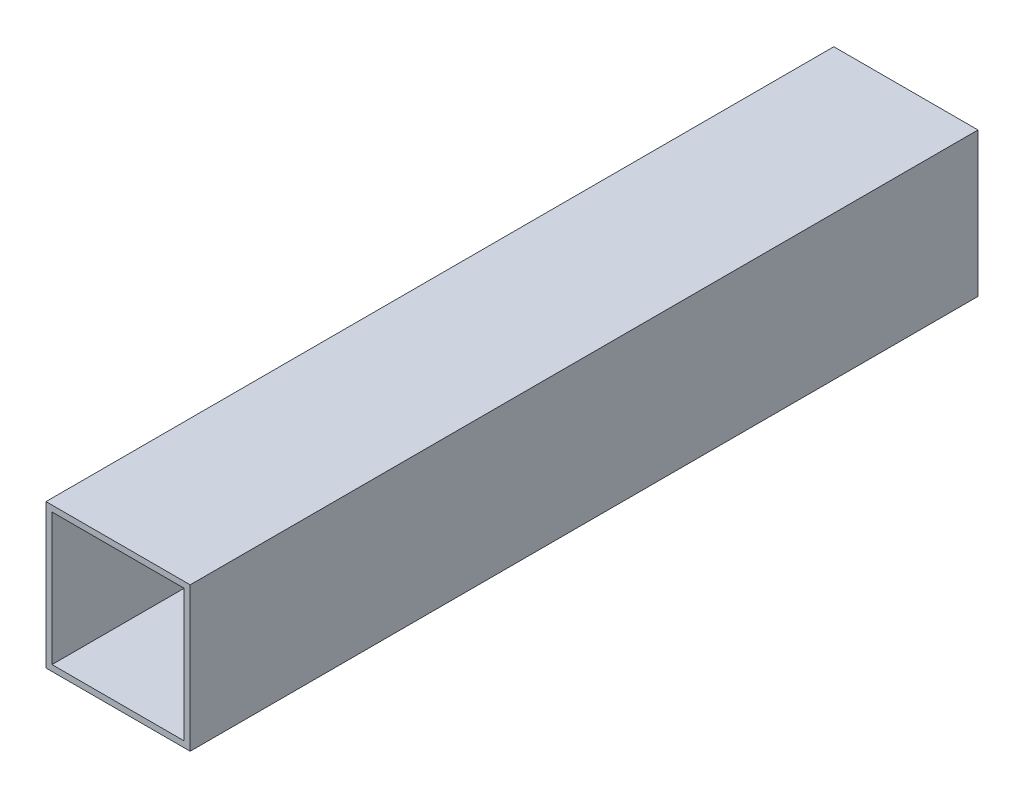
ISO-10303-21;
HEADER;
FILE_DESCRIPTION(('STEP AP214'),'2;1');
FILE_NAME('part.step','',(''),(''),'','','');
FILE_SCHEMA(('AUTOMOTIVE_DESIGN { 1 0 10303 214 1 1 1 1 }'));
ENDSEC;
DATA;
#1=APPLICATION_CONTEXT('core data for automotive mechanical design processes');
#2=APPLICATION_PROTOCOL_DEFINITION('international standard','automotive_design',2000,#1);
#3=PRODUCT_CONTEXT('',#1,'mechanical');
#4=PRODUCT('Part','Part','',(#3));
#5=PRODUCT_RELATED_PRODUCT_CATEGORY('part','',(#4));
#6=PRODUCT_DEFINITION_FORMATION('','',#4);
#7=PRODUCT_DEFINITION_CONTEXT('part definition',#1,'design');
#8=PRODUCT_DEFINITION('design','',#6,#7);
#9=PRODUCT_DEFINITION_SHAPE('','',#8);
#10=(LENGTH_UNIT() NAMED_UNIT(*) SI_UNIT(.MILLI.,.METRE.));
#11=(NAMED_UNIT(*) PLANE_ANGLE_UNIT() SI_UNIT($,.RADIAN.));
#12=(NAMED_UNIT(*) SI_UNIT($,.STERADIAN.) SOLID_ANGLE_UNIT());
#13=UNCERTAINTY_MEASURE_WITH_UNIT(LENGTH_MEASURE(1.E-05),#10,'distance_accuracy_value','');
#14=(GEOMETRIC_REPRESENTATION_CONTEXT(3) GLOBAL_UNCERTAINTY_ASSIGNED_CONTEXT((#13)) GLOBAL_UNIT_ASSIGNED_CONTEXT((#10,
#11,#12)) REPRESENTATION_CONTEXT('',''));
#15=CARTESIAN_POINT('',(0.,0.,0.));
#16=DIRECTION('',(0.,0.,1.));
#17=DIRECTION('',(1.,0.,0.));
#18=AXIS2_PLACEMENT_3D('',#15,#16,#17);
#19=CARTESIAN_POINT('',(0.,0.,208.2));
#20=DIRECTION('',(0.,0.,-1.));
#21=DIRECTION('',(-1.,0.,0.));
#22=AXIS2_PLACEMENT_3D('',#19,#20,#21);
#23=PLANE('',#22);
#24=DIRECTION('',(0.,1.,0.));
#25=VECTOR('',#24,1.);
#26=CARTESIAN_POINT('',(38.1,-38.1,208.2));
#27=LINE('',#26,#25);
#28=CARTESIAN_POINT('',(38.1,-38.1,208.2));
#29=VERTEX_POINT('',#28);
#30=CARTESIAN_POINT('',(38.1,38.1,208.2));
#31=VERTEX_POINT('',#30);
#32=EDGE_CURVE('E139',#29,#31,#27,.T.);
#33=ORIENTED_EDGE('',*,*,#32,.T.);
#34=DIRECTION('',(-1.,0.,0.));
#35=VECTOR('',#34,1.);
#36=CARTESIAN_POINT('',(-38.1,38.1,208.2));
#37=LINE('',#36,#35);
#38=CARTESIAN_POINT('',(-38.1,38.1,208.2));
#39=VERTEX_POINT('',#38);
#40=EDGE_CURVE('E142',#31,#39,#37,.T.);
#41=ORIENTED_EDGE('',*,*,#40,.T.);
#42=DIRECTION('',(0.,-1.,0.));
#43=VECTOR('',#42,1.);
#44=CARTESIAN_POINT('',(-38.1,-38.1,208.2));
#45=LINE('',#44,#43);
#46=CARTESIAN_POINT('',(-38.1,-38.1,208.2));
#47=VERTEX_POINT('',#46);
#48=EDGE_CURVE('E147',#39,#47,#45,.T.);
#49=ORIENTED_EDGE('',*,*,#48,.T.);
#50=DIRECTION('',(1.,0.,0.));
#51=VECTOR('',#50,1.);
#52=CARTESIAN_POINT('',(-38.1,-38.1,208.2));
#53=LINE('',#52,#51);
#54=EDGE_CURVE('E149',#47,#29,#53,.T.);
#55=ORIENTED_EDGE('',*,*,#54,.T.);
#56=EDGE_LOOP('',(#33,#41,#49,#55));
#57=FACE_BOUND('',#56,.T.);
#58=DIRECTION('',(0.,-1.,0.));
#59=VECTOR('',#58,1.);
#60=CARTESIAN_POINT('',(-34.925,-34.925,208.2));
#61=LINE('',#60,#59);
#62=CARTESIAN_POINT('',(-34.925,34.925,208.2));
#63=VERTEX_POINT('',#62);
#64=CARTESIAN_POINT('',(-34.925,-34.925,208.2));
#65=VERTEX_POINT('',#64);
#66=EDGE_CURVE('E101',#63,#65,#61,.T.);
#67=ORIENTED_EDGE('',*,*,#66,.F.);
#68=DIRECTION('',(-1.,0.,0.));
#69=VECTOR('',#68,1.);
#70=CARTESIAN_POINT('',(-34.925,34.925,208.2));
#71=LINE('',#70,#69);
#72=CARTESIAN_POINT('',(34.925,34.925,208.2));
#73=VERTEX_POINT('',#72);
#74=EDGE_CURVE('E128',#73,#63,#71,.T.);
#75=ORIENTED_EDGE('',*,*,#74,.F.);
#76=DIRECTION('',(0.,1.,0.));
#77=VECTOR('',#76,1.);
#78=CARTESIAN_POINT('',(34.925,-34.925,208.2));
#79=LINE('',#78,#77);
#80=CARTESIAN_POINT('',(34.925,-34.925,208.2));
#81=VERTEX_POINT('',#80);
#82=EDGE_CURVE('E125',#81,#73,#79,.T.);
#83=ORIENTED_EDGE('',*,*,#82,.F.);
#84=DIRECTION('',(1.,0.,0.));
#85=VECTOR('',#84,1.);
#86=CARTESIAN_POINT('',(-34.925,-34.925,208.2));
#87=LINE('',#86,#85);
#88=EDGE_CURVE('E115',#65,#81,#87,.T.);
#89=ORIENTED_EDGE('',*,*,#88,.F.);
#90=EDGE_LOOP('',(#67,#75,#83,#89));
#91=FACE_BOUND('',#90,.T.);
#92=ADVANCED_FACE('F39',(#57,#91),#23,.F.);
#93=CARTESIAN_POINT('',(0.,0.,-208.2));
#94=DIRECTION('',(0.,0.,-1.));
#95=DIRECTION('',(-1.,0.,0.));
#96=AXIS2_PLACEMENT_3D('',#93,#94,#95);
#97=PLANE('',#96);
#98=DIRECTION('',(0.,1.,0.));
#99=VECTOR('',#98,1.);
#100=CARTESIAN_POINT('',(38.1,-38.1,-208.2));
#101=LINE('',#100,#99);
#102=CARTESIAN_POINT('',(38.1,-38.1,-208.2));
#103=VERTEX_POINT('',#102);
#104=CARTESIAN_POINT('',(38.1,38.1,-208.2));
#105=VERTEX_POINT('',#104);
#106=EDGE_CURVE('E120',#103,#105,#101,.T.);
#107=ORIENTED_EDGE('',*,*,#106,.F.);
#108=DIRECTION('',(1.,0.,0.));
#109=VECTOR('',#108,1.);
#110=CARTESIAN_POINT('',(-38.1,-38.1,-208.2));
#111=LINE('',#110,#109);
#112=CARTESIAN_POINT('',(-38.1,-38.1,-208.2));
#113=VERTEX_POINT('',#112);
#114=EDGE_CURVE('E143',#113,#103,#111,.T.);
#115=ORIENTED_EDGE('',*,*,#114,.F.);
#116=DIRECTION('',(0.,-1.,0.));
#117=VECTOR('',#116,1.);
#118=CARTESIAN_POINT('',(-38.1,-38.1,-208.2));
#119=LINE('',#118,#117);
#120=CARTESIAN_POINT('',(-38.1,38.1,-208.2));
#121=VERTEX_POINT('',#120);
#122=EDGE_CURVE('E155',#121,#113,#119,.T.);
#123=ORIENTED_EDGE('',*,*,#122,.F.);
#124=DIRECTION('',(-1.,0.,0.));
#125=VECTOR('',#124,1.);
#126=CARTESIAN_POINT('',(-38.1,38.1,-208.2));
#127=LINE('',#126,#125);
#128=EDGE_CURVE('E154',#105,#121,#127,.T.);
#129=ORIENTED_EDGE('',*,*,#128,.F.);
#130=EDGE_LOOP('',(#107,#115,#123,#129));
#131=FACE_BOUND('',#130,.T.);
#132=DIRECTION('',(-1.,0.,0.));
#133=VECTOR('',#132,1.);
#134=CARTESIAN_POINT('',(-34.925,34.925,-208.2));
#135=LINE('',#134,#133);
#136=CARTESIAN_POINT('',(34.925,34.925,-208.2));
#137=VERTEX_POINT('',#136);
#138=CARTESIAN_POINT('',(-34.925,34.925,-208.2));
#139=VERTEX_POINT('',#138);
#140=EDGE_CURVE('E111',#137,#139,#135,.T.);
#141=ORIENTED_EDGE('',*,*,#140,.T.);
#142=DIRECTION('',(0.,-1.,0.));
#143=VECTOR('',#142,1.);
#144=CARTESIAN_POINT('',(-34.925,-34.925,-208.2));
#145=LINE('',#144,#143);
#146=CARTESIAN_POINT('',(-34.925,-34.925,-208.2));
#147=VERTEX_POINT('',#146);
#148=EDGE_CURVE('E62',#139,#147,#145,.T.);
#149=ORIENTED_EDGE('',*,*,#148,.T.);
#150=DIRECTION('',(1.,0.,0.));
#151=VECTOR('',#150,1.);
#152=CARTESIAN_POINT('',(-34.925,-34.925,-208.2));
#153=LINE('',#152,#151);
#154=CARTESIAN_POINT('',(34.925,-34.925,-208.2));
#155=VERTEX_POINT('',#154);
#156=EDGE_CURVE('E118',#147,#155,#153,.T.);
#157=ORIENTED_EDGE('',*,*,#156,.T.);
#158=DIRECTION('',(0.,1.,0.));
#159=VECTOR('',#158,1.);
#160=CARTESIAN_POINT('',(34.925,-34.925,-208.2));
#161=LINE('',#160,#159);
#162=EDGE_CURVE('E135',#155,#137,#161,.T.);
#163=ORIENTED_EDGE('',*,*,#162,.T.);
#164=EDGE_LOOP('',(#141,#149,#157,#163));
#165=FACE_BOUND('',#164,.T.);
#166=ADVANCED_FACE('F171',(#131,#165),#97,.T.);
#167=CARTESIAN_POINT('',(38.1,-38.1,208.2));
#168=DIRECTION('',(-1.,0.,0.));
#169=DIRECTION('',(0.,-1.,0.));
#170=AXIS2_PLACEMENT_3D('',#167,#168,#169);
#171=PLANE('',#170);
#172=ORIENTED_EDGE('',*,*,#106,.T.);
#173=DIRECTION('',(0.,0.,-1.));
#174=VECTOR('',#173,1.);
#175=CARTESIAN_POINT('',(38.1,38.1,208.2));
#176=LINE('',#175,#174);
#177=EDGE_CURVE('E11',#31,#105,#176,.T.);
#178=ORIENTED_EDGE('',*,*,#177,.F.);
#179=ORIENTED_EDGE('',*,*,#32,.F.);
#180=DIRECTION('',(0.,0.,-1.));
#181=VECTOR('',#180,1.);
#182=CARTESIAN_POINT('',(38.1,-38.1,208.2));
#183=LINE('',#182,#181);
#184=EDGE_CURVE('E148',#29,#103,#183,.T.);
#185=ORIENTED_EDGE('',*,*,#184,.T.);
#186=EDGE_LOOP('',(#172,#178,#179,#185));
#187=FACE_BOUND('',#186,.T.);
#188=ADVANCED_FACE('F41',(#187),#171,.F.);
#189=CARTESIAN_POINT('',(-38.1,38.1,208.2));
#190=DIRECTION('',(0.,-1.,0.));
#191=DIRECTION('',(1.,0.,0.));
#192=AXIS2_PLACEMENT_3D('',#189,#190,#191);
#193=PLANE('',#192);
#194=ORIENTED_EDGE('',*,*,#128,.T.);
#195=DIRECTION('',(0.,0.,-1.));
#196=VECTOR('',#195,1.);
#197=CARTESIAN_POINT('',(-38.1,38.1,208.2));
#198=LINE('',#197,#196);
#199=EDGE_CURVE('E50',#39,#121,#198,.T.);
#200=ORIENTED_EDGE('',*,*,#199,.F.);
#201=ORIENTED_EDGE('',*,*,#40,.F.);
#202=ORIENTED_EDGE('',*,*,#177,.T.);
#203=EDGE_LOOP('',(#194,#200,#201,#202));
#204=FACE_BOUND('',#203,.T.);
#205=ADVANCED_FACE('F183',(#204),#193,.F.);
#206=CARTESIAN_POINT('',(-38.1,-38.1,208.2));
#207=DIRECTION('',(1.,0.,0.));
#208=DIRECTION('',(0.,0.,-1.));
#209=AXIS2_PLACEMENT_3D('',#206,#207,#208);
#210=PLANE('',#209);
#211=ORIENTED_EDGE('',*,*,#122,.T.);
#212=DIRECTION('',(0.,0.,-1.));
#213=VECTOR('',#212,1.);
#214=CARTESIAN_POINT('',(-38.1,-38.1,208.2));
#215=LINE('',#214,#213);
#216=EDGE_CURVE('E158',#47,#113,#215,.T.);
#217=ORIENTED_EDGE('',*,*,#216,.F.);
#218=ORIENTED_EDGE('',*,*,#48,.F.);
#219=ORIENTED_EDGE('',*,*,#199,.T.);
#220=EDGE_LOOP('',(#211,#217,#218,#219));
#221=FACE_BOUND('',#220,.T.);
#222=ADVANCED_FACE('F167',(#221),#210,.F.);
#223=CARTESIAN_POINT('',(-38.1,-38.1,208.2));
#224=DIRECTION('',(0.,1.,0.));
#225=DIRECTION('',(-1.,0.,0.));
#226=AXIS2_PLACEMENT_3D('',#223,#224,#225);
#227=PLANE('',#226);
#228=ORIENTED_EDGE('',*,*,#114,.T.);
#229=ORIENTED_EDGE('',*,*,#184,.F.);
#230=ORIENTED_EDGE('',*,*,#54,.F.);
#231=ORIENTED_EDGE('',*,*,#216,.T.);
#232=EDGE_LOOP('',(#228,#229,#230,#231));
#233=FACE_BOUND('',#232,.T.);
#234=ADVANCED_FACE('F180',(#233),#227,.F.);
#235=CARTESIAN_POINT('',(-34.925,-34.925,208.2));
#236=DIRECTION('',(1.,0.,0.));
#237=DIRECTION('',(0.,0.,-1.));
#238=AXIS2_PLACEMENT_3D('',#235,#236,#237);
#239=PLANE('',#238);
#240=ORIENTED_EDGE('',*,*,#148,.F.);
#241=DIRECTION('',(0.,0.,-1.));
#242=VECTOR('',#241,1.);
#243=CARTESIAN_POINT('',(-34.925,34.925,208.2));
#244=LINE('',#243,#242);
#245=EDGE_CURVE('E109',#63,#139,#244,.T.);
#246=ORIENTED_EDGE('',*,*,#245,.F.);
#247=ORIENTED_EDGE('',*,*,#66,.T.);
#248=DIRECTION('',(0.,0.,-1.));
#249=VECTOR('',#248,1.);
#250=CARTESIAN_POINT('',(-34.925,-34.925,208.2));
#251=LINE('',#250,#249);
#252=EDGE_CURVE('E107',#65,#147,#251,.T.);
#253=ORIENTED_EDGE('',*,*,#252,.T.);
#254=EDGE_LOOP('',(#240,#246,#247,#253));
#255=FACE_BOUND('',#254,.T.);
#256=ADVANCED_FACE('F106',(#255),#239,.T.);
#257=CARTESIAN_POINT('',(-34.925,-34.925,208.2));
#258=DIRECTION('',(0.,1.,0.));
#259=DIRECTION('',(0.,0.,1.));
#260=AXIS2_PLACEMENT_3D('',#257,#258,#259);
#261=PLANE('',#260);
#262=ORIENTED_EDGE('',*,*,#156,.F.);
#263=ORIENTED_EDGE('',*,*,#252,.F.);
#264=ORIENTED_EDGE('',*,*,#88,.T.);
#265=DIRECTION('',(0.,0.,-1.));
#266=VECTOR('',#265,1.);
#267=CARTESIAN_POINT('',(34.925,-34.925,208.2));
#268=LINE('',#267,#266);
#269=EDGE_CURVE('E123',#81,#155,#268,.T.);
#270=ORIENTED_EDGE('',*,*,#269,.T.);
#271=EDGE_LOOP('',(#262,#263,#264,#270));
#272=FACE_BOUND('',#271,.T.);
#273=ADVANCED_FACE('F116',(#272),#261,.T.);
#274=CARTESIAN_POINT('',(34.925,-34.925,208.2));
#275=DIRECTION('',(-1.,0.,0.));
#276=DIRECTION('',(0.,0.,1.));
#277=AXIS2_PLACEMENT_3D('',#274,#275,#276);
#278=PLANE('',#277);
#279=ORIENTED_EDGE('',*,*,#162,.F.);
#280=ORIENTED_EDGE('',*,*,#269,.F.);
#281=ORIENTED_EDGE('',*,*,#82,.T.);
#282=DIRECTION('',(0.,0.,-1.));
#283=VECTOR('',#282,1.);
#284=CARTESIAN_POINT('',(34.925,34.925,208.2));
#285=LINE('',#284,#283);
#286=EDGE_CURVE('E53',#73,#137,#285,.T.);
#287=ORIENTED_EDGE('',*,*,#286,.T.);
#288=EDGE_LOOP('',(#279,#280,#281,#287));
#289=FACE_BOUND('',#288,.T.);
#290=ADVANCED_FACE('F206',(#289),#278,.T.);
#291=CARTESIAN_POINT('',(-34.925,34.925,208.2));
#292=DIRECTION('',(0.,-1.,0.));
#293=DIRECTION('',(1.,0.,0.));
#294=AXIS2_PLACEMENT_3D('',#291,#292,#293);
#295=PLANE('',#294);
#296=ORIENTED_EDGE('',*,*,#140,.F.);
#297=ORIENTED_EDGE('',*,*,#286,.F.);
#298=ORIENTED_EDGE('',*,*,#74,.T.);
#299=ORIENTED_EDGE('',*,*,#245,.T.);
#300=EDGE_LOOP('',(#296,#297,#298,#299));
#301=FACE_BOUND('',#300,.T.);
#302=ADVANCED_FACE('F210',(#301),#295,.T.);
#303=CLOSED_SHELL('',(#92,#166,#188,#205,#222,#234,#256,#273,#290,#302));
#304=MANIFOLD_SOLID_BREP('B2',#303);
#305=ADVANCED_BREP_SHAPE_REPRESENTATION('',(#18,#304),#14);
#306=SHAPE_DEFINITION_REPRESENTATION(#9,#305);
ENDSEC;
END-ISO-10303-21;
